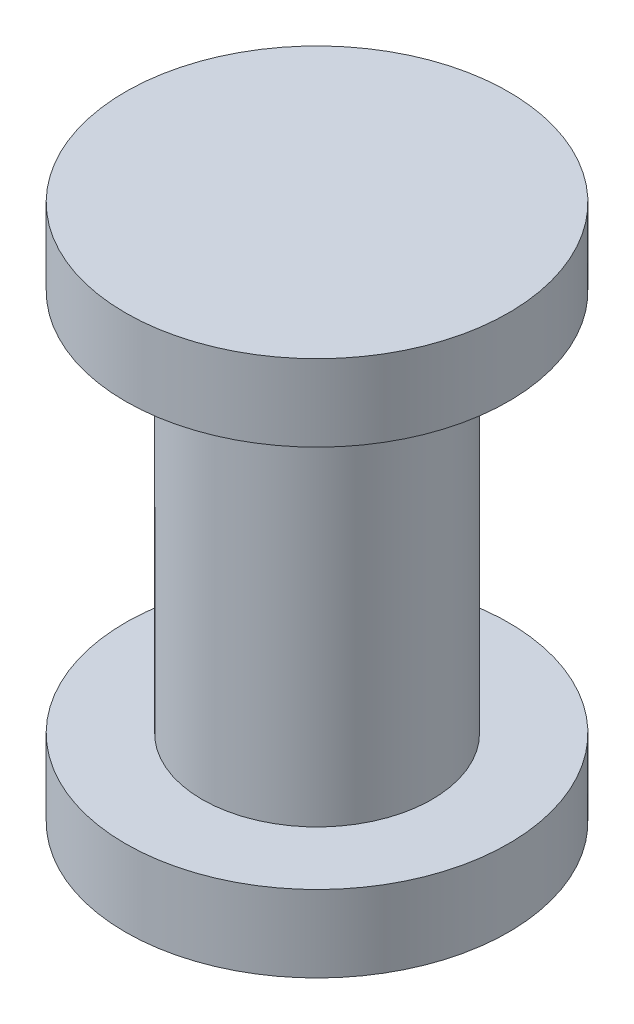
ISO-10303-21;
HEADER;
FILE_DESCRIPTION(('STEP AP214'),'2;1');
FILE_NAME('part.step','',(''),(''),'','','');
FILE_SCHEMA(('AUTOMOTIVE_DESIGN { 1 0 10303 214 1 1 1 1 }'));
ENDSEC;
DATA;
#1=APPLICATION_CONTEXT('core data for automotive mechanical design processes');
#2=APPLICATION_PROTOCOL_DEFINITION('international standard','automotive_design',2000,#1);
#3=PRODUCT_CONTEXT('',#1,'mechanical');
#4=PRODUCT('Part','Part','',(#3));
#5=PRODUCT_RELATED_PRODUCT_CATEGORY('part','',(#4));
#6=PRODUCT_DEFINITION_FORMATION('','',#4);
#7=PRODUCT_DEFINITION_CONTEXT('part definition',#1,'design');
#8=PRODUCT_DEFINITION('design','',#6,#7);
#9=PRODUCT_DEFINITION_SHAPE('','',#8);
#10=(LENGTH_UNIT() NAMED_UNIT(*) SI_UNIT(.MILLI.,.METRE.));
#11=(NAMED_UNIT(*) PLANE_ANGLE_UNIT() SI_UNIT($,.RADIAN.));
#12=(NAMED_UNIT(*) SI_UNIT($,.STERADIAN.) SOLID_ANGLE_UNIT());
#13=UNCERTAINTY_MEASURE_WITH_UNIT(LENGTH_MEASURE(1.E-05),#10,'distance_accuracy_value','');
#14=(GEOMETRIC_REPRESENTATION_CONTEXT(3) GLOBAL_UNCERTAINTY_ASSIGNED_CONTEXT((#13)) GLOBAL_UNIT_ASSIGNED_CONTEXT((#10,
#11,#12)) REPRESENTATION_CONTEXT('',''));
#15=CARTESIAN_POINT('',(0.,0.,0.));
#16=DIRECTION('',(0.,0.,1.));
#17=DIRECTION('',(1.,0.,0.));
#18=AXIS2_PLACEMENT_3D('',#15,#16,#17);
#19=CARTESIAN_POINT('',(-14.7615435905984,19.9486383621148,0.));
#20=DIRECTION('',(0.,-1.,0.));
#21=DIRECTION('',(0.,0.,-1.));
#22=AXIS2_PLACEMENT_3D('',#19,#20,#21);
#23=PLANE('',#22);
#24=CARTESIAN_POINT('',(-14.7615435905984,19.9486383621148,0.));
#25=DIRECTION('',(0.,1.,0.));
#26=DIRECTION('',(0.,0.,1.));
#27=AXIS2_PLACEMENT_3D('',#24,#25,#26);
#28=CIRCLE('',#27,2.5);
#29=CARTESIAN_POINT('',(-14.7615435905984,19.9486383621148,2.5));
#30=VERTEX_POINT('',#29);
#31=EDGE_CURVE('E10',#30,#30,#28,.T.);
#32=ORIENTED_EDGE('',*,*,#31,.F.);
#33=EDGE_LOOP('',(#32));
#34=FACE_BOUND('',#33,.T.);
#35=ADVANCED_FACE('F41',(#34),#23,.T.);
#36=CARTESIAN_POINT('',(-14.7615435905984,26.9486383621148,0.));
#37=DIRECTION('',(0.,1.,0.));
#38=DIRECTION('',(0.,0.,1.));
#39=AXIS2_PLACEMENT_3D('',#36,#37,#38);
#40=CYLINDRICAL_SURFACE('',#39,2.5);
#41=ORIENTED_EDGE('',*,*,#31,.T.);
#42=EDGE_LOOP('',(#41));
#43=FACE_BOUND('',#42,.T.);
#44=CARTESIAN_POINT('',(-14.7615435905984,20.9486383621148,0.));
#45=DIRECTION('',(0.,1.,0.));
#46=DIRECTION('',(0.,0.,1.));
#47=AXIS2_PLACEMENT_3D('',#44,#45,#46);
#48=CIRCLE('',#47,2.5);
#49=CARTESIAN_POINT('',(-14.7615435905984,20.9486383621148,2.5));
#50=VERTEX_POINT('',#49);
#51=EDGE_CURVE('E48',#50,#50,#48,.T.);
#52=ORIENTED_EDGE('',*,*,#51,.F.);
#53=EDGE_LOOP('',(#52));
#54=FACE_BOUND('',#53,.T.);
#55=ADVANCED_FACE('F89',(#43,#54),#40,.T.);
#56=CARTESIAN_POINT('',(-17.2615435905984,20.9486383621148,0.));
#57=DIRECTION('',(0.,1.,0.));
#58=DIRECTION('',(0.,0.,1.));
#59=AXIS2_PLACEMENT_3D('',#56,#57,#58);
#60=PLANE('',#59);
#61=ORIENTED_EDGE('',*,*,#51,.T.);
#62=EDGE_LOOP('',(#61));
#63=FACE_BOUND('',#62,.T.);
#64=CARTESIAN_POINT('',(-14.7615435905984,20.9486383621148,0.));
#65=DIRECTION('',(0.,1.,0.));
#66=DIRECTION('',(0.,0.,1.));
#67=AXIS2_PLACEMENT_3D('',#64,#65,#66);
#68=CIRCLE('',#67,1.5);
#69=CARTESIAN_POINT('',(-14.7615435905984,20.9486383621148,1.5));
#70=VERTEX_POINT('',#69);
#71=EDGE_CURVE('E53',#70,#70,#68,.T.);
#72=ORIENTED_EDGE('',*,*,#71,.F.);
#73=EDGE_LOOP('',(#72));
#74=FACE_BOUND('',#73,.T.);
#75=ADVANCED_FACE('F94',(#63,#74),#60,.T.);
#76=CARTESIAN_POINT('',(-14.7615435905984,26.9486383621148,0.));
#77=DIRECTION('',(0.,1.,0.));
#78=DIRECTION('',(0.,0.,1.));
#79=AXIS2_PLACEMENT_3D('',#76,#77,#78);
#80=CYLINDRICAL_SURFACE('',#79,1.5);
#81=ORIENTED_EDGE('',*,*,#71,.T.);
#82=EDGE_LOOP('',(#81));
#83=FACE_BOUND('',#82,.T.);
#84=CARTESIAN_POINT('',(-14.7615435905984,25.9486383621148,0.));
#85=DIRECTION('',(0.,1.,0.));
#86=DIRECTION('',(0.,0.,1.));
#87=AXIS2_PLACEMENT_3D('',#84,#85,#86);
#88=CIRCLE('',#87,1.5);
#89=CARTESIAN_POINT('',(-14.7615435905984,25.9486383621148,1.5));
#90=VERTEX_POINT('',#89);
#91=EDGE_CURVE('E58',#90,#90,#88,.T.);
#92=ORIENTED_EDGE('',*,*,#91,.F.);
#93=EDGE_LOOP('',(#92));
#94=FACE_BOUND('',#93,.T.);
#95=ADVANCED_FACE('F85',(#83,#94),#80,.T.);
#96=CARTESIAN_POINT('',(-16.2615435905984,25.9486383621148,0.));
#97=DIRECTION('',(0.,-1.,0.));
#98=DIRECTION('',(0.,0.,-1.));
#99=AXIS2_PLACEMENT_3D('',#96,#97,#98);
#100=PLANE('',#99);
#101=ORIENTED_EDGE('',*,*,#91,.T.);
#102=EDGE_LOOP('',(#101));
#103=FACE_BOUND('',#102,.T.);
#104=CARTESIAN_POINT('',(-14.7615435905984,25.9486383621148,0.));
#105=DIRECTION('',(0.,1.,0.));
#106=DIRECTION('',(0.,0.,1.));
#107=AXIS2_PLACEMENT_3D('',#104,#105,#106);
#108=CIRCLE('',#107,2.5);
#109=CARTESIAN_POINT('',(-14.7615435905984,25.9486383621148,2.5));
#110=VERTEX_POINT('',#109);
#111=EDGE_CURVE('E64',#110,#110,#108,.T.);
#112=ORIENTED_EDGE('',*,*,#111,.F.);
#113=EDGE_LOOP('',(#112));
#114=FACE_BOUND('',#113,.T.);
#115=ADVANCED_FACE('F77',(#103,#114),#100,.T.);
#116=CARTESIAN_POINT('',(-14.7615435905984,26.9486383621148,0.));
#117=DIRECTION('',(0.,1.,0.));
#118=DIRECTION('',(0.,0.,1.));
#119=AXIS2_PLACEMENT_3D('',#116,#117,#118);
#120=CYLINDRICAL_SURFACE('',#119,2.5);
#121=ORIENTED_EDGE('',*,*,#111,.T.);
#122=EDGE_LOOP('',(#121));
#123=FACE_BOUND('',#122,.T.);
#124=CARTESIAN_POINT('',(-14.7615435905984,26.9486383621148,0.));
#125=DIRECTION('',(0.,1.,0.));
#126=DIRECTION('',(0.,0.,1.));
#127=AXIS2_PLACEMENT_3D('',#124,#125,#126);
#128=CIRCLE('',#127,2.5);
#129=CARTESIAN_POINT('',(-14.7615435905984,26.9486383621148,2.5));
#130=VERTEX_POINT('',#129);
#131=EDGE_CURVE('E68',#130,#130,#128,.T.);
#132=ORIENTED_EDGE('',*,*,#131,.F.);
#133=EDGE_LOOP('',(#132));
#134=FACE_BOUND('',#133,.T.);
#135=ADVANCED_FACE('F75',(#123,#134),#120,.T.);
#136=CARTESIAN_POINT('',(-14.7615435905984,26.9486383621148,0.));
#137=DIRECTION('',(0.,1.,0.));
#138=DIRECTION('',(0.,0.,1.));
#139=AXIS2_PLACEMENT_3D('',#136,#137,#138);
#140=PLANE('',#139);
#141=ORIENTED_EDGE('',*,*,#131,.T.);
#142=EDGE_LOOP('',(#141));
#143=FACE_BOUND('',#142,.T.);
#144=ADVANCED_FACE('F73',(#143),#140,.T.);
#145=CLOSED_SHELL('',(#35,#55,#75,#95,#115,#135,#144));
#146=MANIFOLD_SOLID_BREP('B2',#145);
#147=ADVANCED_BREP_SHAPE_REPRESENTATION('',(#18,#146),#14);
#148=SHAPE_DEFINITION_REPRESENTATION(#9,#147);
ENDSEC;
END-ISO-10303-21;
